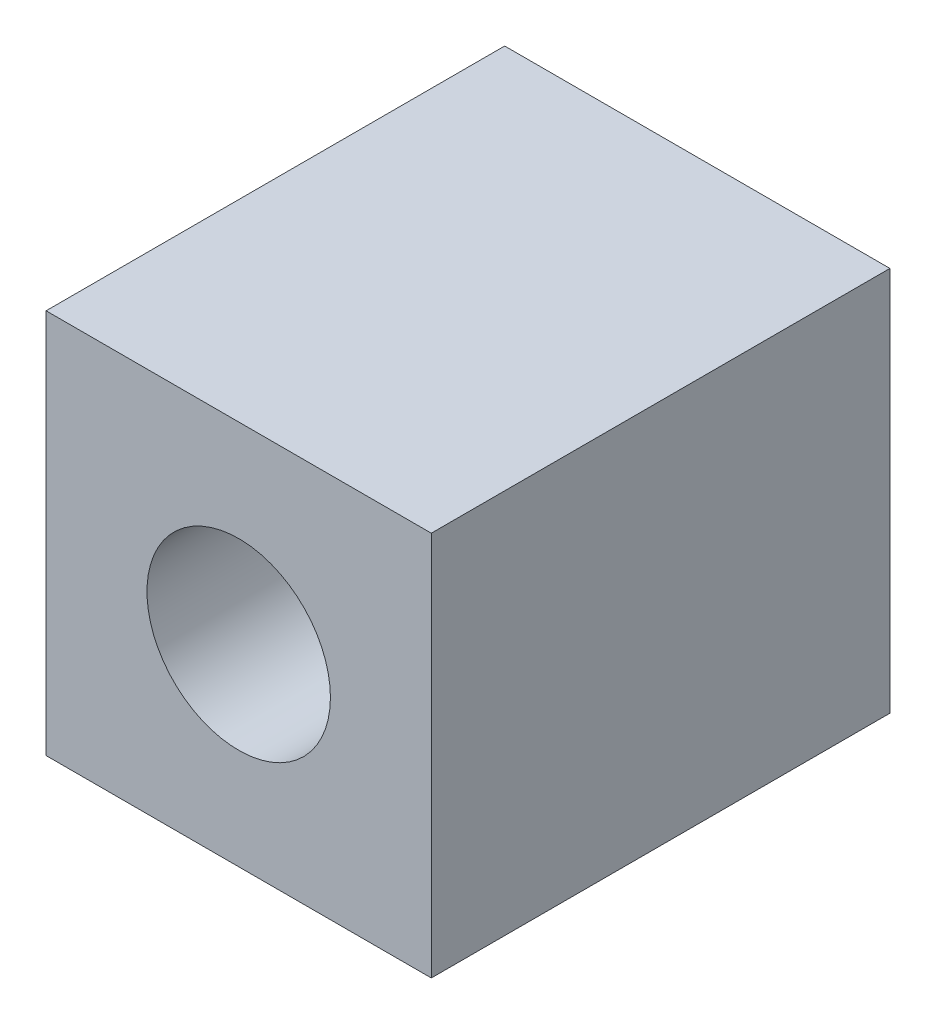
ISO-10303-21;
HEADER;
FILE_DESCRIPTION(('STEP AP214'),'2;1');
FILE_NAME('part.step','',(''),(''),'','','');
FILE_SCHEMA(('AUTOMOTIVE_DESIGN { 1 0 10303 214 1 1 1 1 }'));
ENDSEC;
DATA;
#1=APPLICATION_CONTEXT('core data for automotive mechanical design processes');
#2=APPLICATION_PROTOCOL_DEFINITION('international standard','automotive_design',2000,#1);
#3=PRODUCT_CONTEXT('',#1,'mechanical');
#4=PRODUCT('Part','Part','',(#3));
#5=PRODUCT_RELATED_PRODUCT_CATEGORY('part','',(#4));
#6=PRODUCT_DEFINITION_FORMATION('','',#4);
#7=PRODUCT_DEFINITION_CONTEXT('part definition',#1,'design');
#8=PRODUCT_DEFINITION('design','',#6,#7);
#9=PRODUCT_DEFINITION_SHAPE('','',#8);
#10=(LENGTH_UNIT() NAMED_UNIT(*) SI_UNIT(.MILLI.,.METRE.));
#11=(NAMED_UNIT(*) PLANE_ANGLE_UNIT() SI_UNIT($,.RADIAN.));
#12=(NAMED_UNIT(*) SI_UNIT($,.STERADIAN.) SOLID_ANGLE_UNIT());
#13=UNCERTAINTY_MEASURE_WITH_UNIT(LENGTH_MEASURE(1.E-05),#10,'distance_accuracy_value','');
#14=(GEOMETRIC_REPRESENTATION_CONTEXT(3) GLOBAL_UNCERTAINTY_ASSIGNED_CONTEXT((#13)) GLOBAL_UNIT_ASSIGNED_CONTEXT((#10,
#11,#12)) REPRESENTATION_CONTEXT('',''));
#15=CARTESIAN_POINT('',(0.,0.,0.));
#16=DIRECTION('',(0.,0.,1.));
#17=DIRECTION('',(1.,0.,0.));
#18=AXIS2_PLACEMENT_3D('',#15,#16,#17);
#19=CARTESIAN_POINT('',(21.,-21.,50.));
#20=DIRECTION('',(-1.,0.,0.));
#21=DIRECTION('',(0.,0.,1.));
#22=AXIS2_PLACEMENT_3D('',#19,#20,#21);
#23=PLANE('',#22);
#24=DIRECTION('',(0.,1.,0.));
#25=VECTOR('',#24,1.);
#26=CARTESIAN_POINT('',(21.,-21.,0.));
#27=LINE('',#26,#25);
#28=CARTESIAN_POINT('',(21.,-21.,0.));
#29=VERTEX_POINT('',#28);
#30=CARTESIAN_POINT('',(21.,21.,0.));
#31=VERTEX_POINT('',#30);
#32=EDGE_CURVE('E100',#29,#31,#27,.T.);
#33=ORIENTED_EDGE('',*,*,#32,.T.);
#34=DIRECTION('',(0.,0.,-1.));
#35=VECTOR('',#34,1.);
#36=CARTESIAN_POINT('',(21.,21.,50.));
#37=LINE('',#36,#35);
#38=CARTESIAN_POINT('',(21.,21.,50.));
#39=VERTEX_POINT('',#38);
#40=EDGE_CURVE('E11',#39,#31,#37,.T.);
#41=ORIENTED_EDGE('',*,*,#40,.F.);
#42=DIRECTION('',(0.,1.,0.));
#43=VECTOR('',#42,1.);
#44=CARTESIAN_POINT('',(21.,-21.,50.));
#45=LINE('',#44,#43);
#46=CARTESIAN_POINT('',(21.,-21.,50.));
#47=VERTEX_POINT('',#46);
#48=EDGE_CURVE('E88',#47,#39,#45,.T.);
#49=ORIENTED_EDGE('',*,*,#48,.F.);
#50=DIRECTION('',(0.,0.,-1.));
#51=VECTOR('',#50,1.);
#52=CARTESIAN_POINT('',(21.,-21.,50.));
#53=LINE('',#52,#51);
#54=EDGE_CURVE('E96',#47,#29,#53,.T.);
#55=ORIENTED_EDGE('',*,*,#54,.T.);
#56=EDGE_LOOP('',(#33,#41,#49,#55));
#57=FACE_BOUND('',#56,.T.);
#58=ADVANCED_FACE('F37',(#57),#23,.F.);
#59=CARTESIAN_POINT('',(-21.,21.,50.));
#60=DIRECTION('',(0.,-1.,0.));
#61=DIRECTION('',(0.,0.,-1.));
#62=AXIS2_PLACEMENT_3D('',#59,#60,#61);
#63=PLANE('',#62);
#64=DIRECTION('',(-1.,0.,0.));
#65=VECTOR('',#64,1.);
#66=CARTESIAN_POINT('',(-21.,21.,0.));
#67=LINE('',#66,#65);
#68=CARTESIAN_POINT('',(-21.,21.,0.));
#69=VERTEX_POINT('',#68);
#70=EDGE_CURVE('E92',#31,#69,#67,.T.);
#71=ORIENTED_EDGE('',*,*,#70,.T.);
#72=DIRECTION('',(0.,0.,-1.));
#73=VECTOR('',#72,1.);
#74=CARTESIAN_POINT('',(-21.,21.,50.));
#75=LINE('',#74,#73);
#76=CARTESIAN_POINT('',(-21.,21.,50.));
#77=VERTEX_POINT('',#76);
#78=EDGE_CURVE('E45',#77,#69,#75,.T.);
#79=ORIENTED_EDGE('',*,*,#78,.F.);
#80=DIRECTION('',(-1.,0.,0.));
#81=VECTOR('',#80,1.);
#82=CARTESIAN_POINT('',(-21.,21.,50.));
#83=LINE('',#82,#81);
#84=EDGE_CURVE('E83',#39,#77,#83,.T.);
#85=ORIENTED_EDGE('',*,*,#84,.F.);
#86=ORIENTED_EDGE('',*,*,#40,.T.);
#87=EDGE_LOOP('',(#71,#79,#85,#86));
#88=FACE_BOUND('',#87,.T.);
#89=ADVANCED_FACE('F91',(#88),#63,.F.);
#90=CARTESIAN_POINT('',(-21.,-21.,50.));
#91=DIRECTION('',(1.,0.,0.));
#92=DIRECTION('',(0.,0.,-1.));
#93=AXIS2_PLACEMENT_3D('',#90,#91,#92);
#94=PLANE('',#93);
#95=DIRECTION('',(0.,-1.,0.));
#96=VECTOR('',#95,1.);
#97=CARTESIAN_POINT('',(-21.,-21.,0.));
#98=LINE('',#97,#96);
#99=CARTESIAN_POINT('',(-21.,-21.,0.));
#100=VERTEX_POINT('',#99);
#101=EDGE_CURVE('E70',#69,#100,#98,.T.);
#102=ORIENTED_EDGE('',*,*,#101,.T.);
#103=DIRECTION('',(0.,0.,-1.));
#104=VECTOR('',#103,1.);
#105=CARTESIAN_POINT('',(-21.,-21.,50.));
#106=LINE('',#105,#104);
#107=CARTESIAN_POINT('',(-21.,-21.,50.));
#108=VERTEX_POINT('',#107);
#109=EDGE_CURVE('E93',#108,#100,#106,.T.);
#110=ORIENTED_EDGE('',*,*,#109,.F.);
#111=DIRECTION('',(0.,-1.,0.));
#112=VECTOR('',#111,1.);
#113=CARTESIAN_POINT('',(-21.,-21.,50.));
#114=LINE('',#113,#112);
#115=EDGE_CURVE('E86',#77,#108,#114,.T.);
#116=ORIENTED_EDGE('',*,*,#115,.F.);
#117=ORIENTED_EDGE('',*,*,#78,.T.);
#118=EDGE_LOOP('',(#102,#110,#116,#117));
#119=FACE_BOUND('',#118,.T.);
#120=ADVANCED_FACE('F94',(#119),#94,.F.);
#121=CARTESIAN_POINT('',(-21.,-21.,50.));
#122=DIRECTION('',(0.,1.,0.));
#123=DIRECTION('',(0.,0.,1.));
#124=AXIS2_PLACEMENT_3D('',#121,#122,#123);
#125=PLANE('',#124);
#126=DIRECTION('',(1.,0.,0.));
#127=VECTOR('',#126,1.);
#128=CARTESIAN_POINT('',(-21.,-21.,0.));
#129=LINE('',#128,#127);
#130=EDGE_CURVE('E76',#100,#29,#129,.T.);
#131=ORIENTED_EDGE('',*,*,#130,.T.);
#132=ORIENTED_EDGE('',*,*,#54,.F.);
#133=DIRECTION('',(1.,0.,0.));
#134=VECTOR('',#133,1.);
#135=CARTESIAN_POINT('',(-21.,-21.,50.));
#136=LINE('',#135,#134);
#137=EDGE_CURVE('E53',#108,#47,#136,.T.);
#138=ORIENTED_EDGE('',*,*,#137,.F.);
#139=ORIENTED_EDGE('',*,*,#109,.T.);
#140=EDGE_LOOP('',(#131,#132,#138,#139));
#141=FACE_BOUND('',#140,.T.);
#142=ADVANCED_FACE('F108',(#141),#125,.F.);
#143=CARTESIAN_POINT('',(0.,0.,50.));
#144=DIRECTION('',(0.,0.,-1.));
#145=DIRECTION('',(-1.,0.,0.));
#146=AXIS2_PLACEMENT_3D('',#143,#144,#145);
#147=PLANE('',#146);
#148=CARTESIAN_POINT('',(0.,0.,50.));
#149=DIRECTION('',(0.,0.,1.));
#150=DIRECTION('',(1.,0.,0.));
#151=AXIS2_PLACEMENT_3D('',#148,#149,#150);
#152=CIRCLE('',#151,10.);
#153=CARTESIAN_POINT('',(10.,0.,50.));
#154=VERTEX_POINT('',#153);
#155=EDGE_CURVE('E114',#154,#154,#152,.T.);
#156=ORIENTED_EDGE('',*,*,#155,.F.);
#157=EDGE_LOOP('',(#156));
#158=FACE_BOUND('',#157,.T.);
#159=ORIENTED_EDGE('',*,*,#48,.T.);
#160=ORIENTED_EDGE('',*,*,#84,.T.);
#161=ORIENTED_EDGE('',*,*,#115,.T.);
#162=ORIENTED_EDGE('',*,*,#137,.T.);
#163=EDGE_LOOP('',(#159,#160,#161,#162));
#164=FACE_BOUND('',#163,.T.);
#165=ADVANCED_FACE('F84',(#158,#164),#147,.F.);
#166=CARTESIAN_POINT('',(0.,0.,0.));
#167=DIRECTION('',(0.,0.,-1.));
#168=DIRECTION('',(-1.,0.,0.));
#169=AXIS2_PLACEMENT_3D('',#166,#167,#168);
#170=PLANE('',#169);
#171=CARTESIAN_POINT('',(0.,0.,0.));
#172=DIRECTION('',(0.,0.,1.));
#173=DIRECTION('',(1.,0.,0.));
#174=AXIS2_PLACEMENT_3D('',#171,#172,#173);
#175=CIRCLE('',#174,10.);
#176=CARTESIAN_POINT('',(10.,0.,0.));
#177=VERTEX_POINT('',#176);
#178=EDGE_CURVE('E103',#177,#177,#175,.T.);
#179=ORIENTED_EDGE('',*,*,#178,.T.);
#180=EDGE_LOOP('',(#179));
#181=FACE_BOUND('',#180,.T.);
#182=ORIENTED_EDGE('',*,*,#32,.F.);
#183=ORIENTED_EDGE('',*,*,#130,.F.);
#184=ORIENTED_EDGE('',*,*,#101,.F.);
#185=ORIENTED_EDGE('',*,*,#70,.F.);
#186=EDGE_LOOP('',(#182,#183,#184,#185));
#187=FACE_BOUND('',#186,.T.);
#188=ADVANCED_FACE('F111',(#181,#187),#170,.T.);
#189=CARTESIAN_POINT('',(0.,0.,0.));
#190=DIRECTION('',(0.,0.,1.));
#191=DIRECTION('',(1.,0.,0.));
#192=AXIS2_PLACEMENT_3D('',#189,#190,#191);
#193=CYLINDRICAL_SURFACE('',#192,10.);
#194=ORIENTED_EDGE('',*,*,#178,.F.);
#195=EDGE_LOOP('',(#194));
#196=FACE_BOUND('',#195,.T.);
#197=ORIENTED_EDGE('',*,*,#155,.T.);
#198=EDGE_LOOP('',(#197));
#199=FACE_BOUND('',#198,.T.);
#200=ADVANCED_FACE('F121',(#196,#199),#193,.F.);
#201=CLOSED_SHELL('',(#58,#89,#120,#142,#165,#188,#200));
#202=MANIFOLD_SOLID_BREP('B2',#201);
#203=ADVANCED_BREP_SHAPE_REPRESENTATION('',(#18,#202),#14);
#204=SHAPE_DEFINITION_REPRESENTATION(#9,#203);
ENDSEC;
END-ISO-10303-21;
